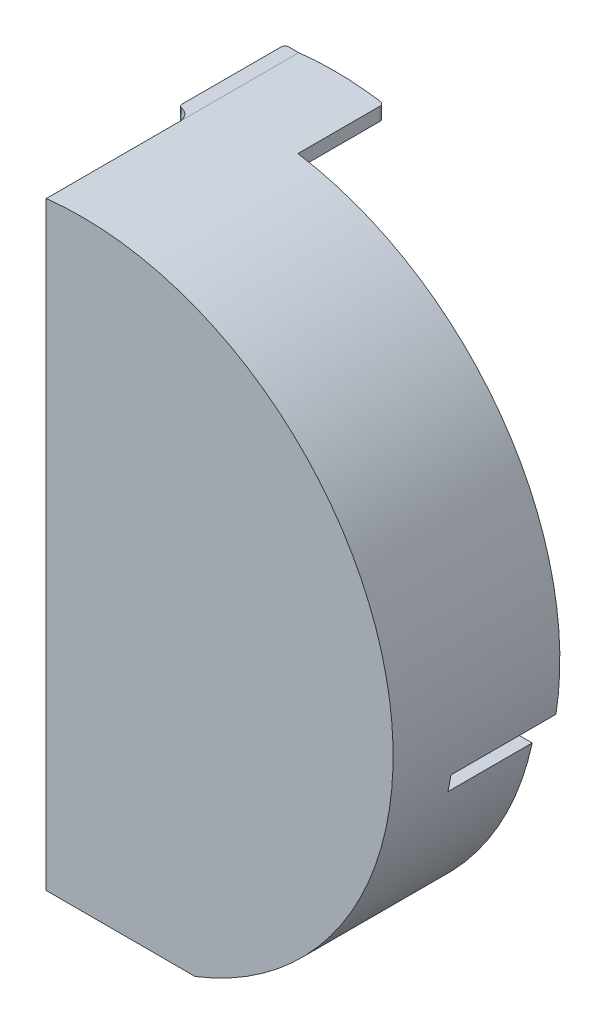
ISO-10303-21;
HEADER;
FILE_DESCRIPTION(('STEP AP214'),'2;1');
FILE_NAME('part.step','',(''),(''),'','','');
FILE_SCHEMA(('AUTOMOTIVE_DESIGN { 1 0 10303 214 1 1 1 1 }'));
ENDSEC;
DATA;
#1=APPLICATION_CONTEXT('core data for automotive mechanical design processes');
#2=APPLICATION_PROTOCOL_DEFINITION('international standard','automotive_design',2000,#1);
#3=PRODUCT_CONTEXT('',#1,'mechanical');
#4=PRODUCT('Part','Part','',(#3));
#5=PRODUCT_RELATED_PRODUCT_CATEGORY('part','',(#4));
#6=PRODUCT_DEFINITION_FORMATION('','',#4);
#7=PRODUCT_DEFINITION_CONTEXT('part definition',#1,'design');
#8=PRODUCT_DEFINITION('design','',#6,#7);
#9=PRODUCT_DEFINITION_SHAPE('','',#8);
#10=(LENGTH_UNIT() NAMED_UNIT(*) SI_UNIT(.MILLI.,.METRE.));
#11=(NAMED_UNIT(*) PLANE_ANGLE_UNIT() SI_UNIT($,.RADIAN.));
#12=(NAMED_UNIT(*) SI_UNIT($,.STERADIAN.) SOLID_ANGLE_UNIT());
#13=UNCERTAINTY_MEASURE_WITH_UNIT(LENGTH_MEASURE(1.E-05),#10,'distance_accuracy_value','');
#14=(GEOMETRIC_REPRESENTATION_CONTEXT(3) GLOBAL_UNCERTAINTY_ASSIGNED_CONTEXT((#13)) GLOBAL_UNIT_ASSIGNED_CONTEXT((#10,
#11,#12)) REPRESENTATION_CONTEXT('',''));
#15=CARTESIAN_POINT('',(0.,0.,0.));
#16=DIRECTION('',(0.,0.,1.));
#17=DIRECTION('',(1.,0.,0.));
#18=AXIS2_PLACEMENT_3D('',#15,#16,#17);
#19=CARTESIAN_POINT('',(38.1000196782588,0.,-197.056224621407));
#20=DIRECTION('',(1.,0.,0.));
#21=DIRECTION('',(0.,0.,-1.));
#22=AXIS2_PLACEMENT_3D('',#19,#20,#21);
#23=PLANE('',#22);
#24=DIRECTION('',(0.,0.,1.));
#25=VECTOR('',#24,1.);
#26=CARTESIAN_POINT('',(38.1000196782588,226.7922128743,-197.056224621407));
#27=LINE('',#26,#25);
#28=CARTESIAN_POINT('',(38.1000196782588,226.7922128743,-43.5200000000002));
#29=VERTEX_POINT('',#28);
#30=CARTESIAN_POINT('',(38.1000196782588,226.7922128743,-37.52));
#31=VERTEX_POINT('',#30);
#32=EDGE_CURVE('E255',#29,#31,#27,.T.);
#33=ORIENTED_EDGE('',*,*,#32,.F.);
#34=DIRECTION('',(0.,1.,0.));
#35=VECTOR('',#34,1.);
#36=CARTESIAN_POINT('',(38.1000196782588,236.956511833957,-43.5200000000002));
#37=LINE('',#36,#35);
#38=CARTESIAN_POINT('',(38.1000196782588,226.822372134047,-43.5200000000002));
#39=VERTEX_POINT('',#38);
#40=EDGE_CURVE('E205',#29,#39,#37,.T.);
#41=ORIENTED_EDGE('',*,*,#40,.T.);
#42=DIRECTION('',(0.,0.,1.));
#43=VECTOR('',#42,1.);
#44=CARTESIAN_POINT('',(38.1000196782588,226.822372134047,-384.810189539458));
#45=LINE('',#44,#43);
#46=CARTESIAN_POINT('',(38.1000196782588,226.822372134047,-37.52));
#47=VERTEX_POINT('',#46);
#48=EDGE_CURVE('E230',#39,#47,#45,.T.);
#49=ORIENTED_EDGE('',*,*,#48,.T.);
#50=DIRECTION('',(0.,1.,0.));
#51=VECTOR('',#50,1.);
#52=CARTESIAN_POINT('',(38.1000196782588,0.,-37.52));
#53=LINE('',#52,#51);
#54=EDGE_CURVE('E233',#31,#47,#53,.T.);
#55=ORIENTED_EDGE('',*,*,#54,.F.);
#56=EDGE_LOOP('',(#33,#41,#49,#55));
#57=FACE_BOUND('',#56,.T.);
#58=ADVANCED_FACE('F34',(#57),#23,.T.);
#59=CARTESIAN_POINT('',(0.,0.,-37.52));
#60=DIRECTION('',(0.,0.,-1.));
#61=DIRECTION('',(1.,0.,0.));
#62=AXIS2_PLACEMENT_3D('',#59,#60,#61);
#63=PLANE('',#62);
#64=CARTESIAN_POINT('',(0.,0.,-37.52));
#65=DIRECTION('',(0.,0.,-1.));
#66=DIRECTION('',(-1.,0.,0.));
#67=AXIS2_PLACEMENT_3D('',#64,#65,#66);
#68=CIRCLE('',#67,230.);
#69=CARTESIAN_POINT('',(224.453064385275,-50.2077871257001,-37.52));
#70=VERTEX_POINT('',#69);
#71=CARTESIAN_POINT('',(54.1856336417679,-223.526099386269,-37.52));
#72=VERTEX_POINT('',#71);
#73=EDGE_CURVE('E283',#70,#72,#68,.T.);
#74=ORIENTED_EDGE('',*,*,#73,.F.);
#75=DIRECTION('',(1.,0.,0.));
#76=VECTOR('',#75,1.);
#77=CARTESIAN_POINT('',(0.,-50.2077871257001,-37.52));
#78=LINE('',#77,#76);
#79=CARTESIAN_POINT('',(234.689535582523,-50.2077871257001,-37.52));
#80=VERTEX_POINT('',#79);
#81=EDGE_CURVE('E227',#70,#80,#78,.T.);
#82=ORIENTED_EDGE('',*,*,#81,.T.);
#83=CARTESIAN_POINT('',(0.,0.,-37.52));
#84=DIRECTION('',(0.,0.,-1.));
#85=DIRECTION('',(-1.,0.,0.));
#86=AXIS2_PLACEMENT_3D('',#83,#84,#85);
#87=CIRCLE('',#86,240.);
#88=CARTESIAN_POINT('',(87.3846834013827,-223.526099386269,-37.52));
#89=VERTEX_POINT('',#88);
#90=EDGE_CURVE('E284',#80,#89,#87,.T.);
#91=ORIENTED_EDGE('',*,*,#90,.T.);
#92=DIRECTION('',(-1.,0.,0.));
#93=VECTOR('',#92,1.);
#94=CARTESIAN_POINT('',(0.,-223.526099386269,-37.52));
#95=LINE('',#94,#93);
#96=EDGE_CURVE('E244',#89,#72,#95,.T.);
#97=ORIENTED_EDGE('',*,*,#96,.T.);
#98=EDGE_LOOP('',(#74,#82,#91,#97));
#99=FACE_BOUND('',#98,.T.);
#100=ADVANCED_FACE('F348',(#99),#63,.T.);
#101=CARTESIAN_POINT('',(0.,0.,75.));
#102=DIRECTION('',(0.,0.,-1.));
#103=DIRECTION('',(-1.,0.,0.));
#104=AXIS2_PLACEMENT_3D('',#101,#102,#103);
#105=CYLINDRICAL_SURFACE('',#104,240.);
#106=DIRECTION('',(0.,0.,1.));
#107=VECTOR('',#106,1.);
#108=CARTESIAN_POINT('',(38.1000196782588,236.956511833957,-197.056224621407));
#109=LINE('',#108,#107);
#110=CARTESIAN_POINT('',(38.1000196782588,236.956511833957,-116.72));
#111=VERTEX_POINT('',#110);
#112=CARTESIAN_POINT('',(38.1000196782588,236.956511833957,-53.5200000000002));
#113=VERTEX_POINT('',#112);
#114=EDGE_CURVE('E259',#111,#113,#109,.T.);
#115=ORIENTED_EDGE('',*,*,#114,.F.);
#116=CARTESIAN_POINT('',(38.1000196782588,236.956511833957,-116.72));
#117=CARTESIAN_POINT('',(38.1000283332697,236.95651011048,-116.803621264716));
#118=CARTESIAN_POINT('',(38.0965234851168,236.957073975032,-116.887238332852));
#119=CARTESIAN_POINT('',(38.0825536393504,236.959319715328,-117.05386781502));
#120=CARTESIAN_POINT('',(38.0720891647448,236.961001507062,-117.136880274014));
#121=CARTESIAN_POINT('',(38.0442825757925,236.965467423593,-117.301624172853));
#122=CARTESIAN_POINT('',(38.0269482227035,236.968250304427,-117.383356950473));
#123=CARTESIAN_POINT('',(37.985551774974,236.974889580629,-117.545031874675));
#124=CARTESIAN_POINT('',(37.9614897270087,236.978745968551,-117.624974033675));
#125=CARTESIAN_POINT('',(37.8794315428356,236.991881261317,-117.861324745224));
#126=CARTESIAN_POINT('',(37.8115480992835,237.002728759292,-118.014347353355));
#127=CARTESIAN_POINT('',(37.65154502077,237.028200165548,-118.306670709139));
#128=CARTESIAN_POINT('',(37.5594270297313,237.042823817678,-118.445972386655));
#129=CARTESIAN_POINT('',(37.353019352501,237.075437143725,-118.707950170494));
#130=CARTESIAN_POINT('',(37.2386040486746,237.093445866905,-118.830525058097));
#131=CARTESIAN_POINT('',(36.9912276153533,237.132167202571,-119.054784150787));
#132=CARTESIAN_POINT('',(36.8582623711494,237.152880414896,-119.156463708508));
#133=CARTESIAN_POINT('',(36.5758712262327,237.196598371745,-119.337310977152));
#134=CARTESIAN_POINT('',(36.4262671701791,237.219627601451,-119.41619432807));
#135=CARTESIAN_POINT('',(36.1161583087637,237.267038708309,-119.54768359203));
#136=CARTESIAN_POINT('',(35.9556583259373,237.291419986181,-119.600301045322));
#137=CARTESIAN_POINT('',(35.678657277023,237.333197369238,-119.665975831675));
#138=CARTESIAN_POINT('',(35.56378297137,237.350438918612,-119.686219970494));
#139=CARTESIAN_POINT('',(35.3326315107385,237.384959396251,-119.713231485017));
#140=CARTESIAN_POINT('',(35.2163565186467,237.402238239694,-119.720017483976));
#141=CARTESIAN_POINT('',(35.1000196782588,237.419436059026,-119.72));
#142=B_SPLINE_CURVE_WITH_KNOTS('',3,(#116,#117,#118,#119,#120,#121,#122,#123,#124,#125,#126,
#127,#128,#129,#130,#131,#132,#133,#134,#135,#136,#137,#138,#139,#140,#141),.UNSPECIFIED.,.F.,
.F.,(4,2,2,2,2,2,2,2,2,2,2,2,4),(0.,0.250781000405409,0.501543157033502,0.752022818571146,
1.00250074238649,1.50318660668064,2.00383851627479,2.5073970693745,3.0110674989086,
3.52077341414592,4.03025518618738,4.38325635885706,4.73576870987701),.UNSPECIFIED.);
#143=CARTESIAN_POINT('',(35.1000196782588,237.419436059026,-119.72));
#144=VERTEX_POINT('',#143);
#145=EDGE_CURVE('E327',#111,#144,#142,.T.);
#146=ORIENTED_EDGE('',*,*,#145,.T.);
#147=CARTESIAN_POINT('',(0.,0.,-119.72));
#148=DIRECTION('',(0.,0.,1.));
#149=DIRECTION('',(1.,0.,0.));
#150=AXIS2_PLACEMENT_3D('',#147,#148,#149);
#151=CIRCLE('',#150,240.);
#152=CARTESIAN_POINT('',(-27.4110339249947,238.429518346959,-119.72));
#153=VERTEX_POINT('',#152);
#154=EDGE_CURVE('E238',#144,#153,#151,.T.);
#155=ORIENTED_EDGE('',*,*,#154,.T.);
#156=DIRECTION('',(0.,0.,1.));
#157=VECTOR('',#156,1.);
#158=CARTESIAN_POINT('',(-27.4110339249947,238.429518346959,-197.056224621407));
#159=LINE('',#158,#157);
#160=CARTESIAN_POINT('',(-27.4110339249947,238.429518346959,-27.7270639354609));
#161=VERTEX_POINT('',#160);
#162=EDGE_CURVE('E239',#153,#161,#159,.T.);
#163=ORIENTED_EDGE('',*,*,#162,.T.);
#164=DIRECTION('',(0.,0.,-1.));
#165=VECTOR('',#164,1.);
#166=CARTESIAN_POINT('',(-27.4110339249947,238.429518346959,75.));
#167=LINE('',#166,#165);
#168=CARTESIAN_POINT('',(-27.4110339249947,238.429518346959,75.));
#169=VERTEX_POINT('',#168);
#170=EDGE_CURVE('E273',#169,#161,#167,.T.);
#171=ORIENTED_EDGE('',*,*,#170,.F.);
#172=CARTESIAN_POINT('',(0.,0.,75.));
#173=DIRECTION('',(0.,0.,1.));
#174=DIRECTION('',(1.,0.,0.));
#175=AXIS2_PLACEMENT_3D('',#172,#173,#174);
#176=CIRCLE('',#175,240.);
#177=CARTESIAN_POINT('',(87.3846834013827,-223.526099386269,75.));
#178=VERTEX_POINT('',#177);
#179=EDGE_CURVE('E286',#178,#169,#176,.T.);
#180=ORIENTED_EDGE('',*,*,#179,.F.);
#181=DIRECTION('',(0.,0.,-1.));
#182=VECTOR('',#181,1.);
#183=CARTESIAN_POINT('',(87.3846834013827,-223.526099386269,75.));
#184=LINE('',#183,#182);
#185=EDGE_CURVE('E266',#178,#89,#184,.T.);
#186=ORIENTED_EDGE('',*,*,#185,.T.);
#187=ORIENTED_EDGE('',*,*,#90,.F.);
#188=DIRECTION('',(0.,0.,-1.));
#189=VECTOR('',#188,1.);
#190=CARTESIAN_POINT('',(234.689535582523,-50.2077871257001,75.));
#191=LINE('',#190,#189);
#192=CARTESIAN_POINT('',(234.689535582523,-50.2077871257001,27.418));
#193=VERTEX_POINT('',#192);
#194=EDGE_CURVE('E299',#193,#80,#191,.T.);
#195=ORIENTED_EDGE('',*,*,#194,.F.);
#196=CARTESIAN_POINT('',(0.,0.,27.4179999999999));
#197=DIRECTION('',(0.,0.,-1.));
#198=DIRECTION('',(0.,1.,0.));
#199=AXIS2_PLACEMENT_3D('',#196,#197,#198);
#200=CIRCLE('',#199,240.);
#201=CARTESIAN_POINT('',(236.977735538125,-37.9677871257001,27.418));
#202=VERTEX_POINT('',#201);
#203=EDGE_CURVE('E184',#202,#193,#200,.T.);
#204=ORIENTED_EDGE('',*,*,#203,.F.);
#205=DIRECTION('',(0.,0.,-1.));
#206=VECTOR('',#205,1.);
#207=CARTESIAN_POINT('',(236.977735538125,-37.9677871257001,75.));
#208=LINE('',#207,#206);
#209=CARTESIAN_POINT('',(236.977735538125,-37.9677871257001,-53.52));
#210=VERTEX_POINT('',#209);
#211=EDGE_CURVE('E176',#202,#210,#208,.T.);
#212=ORIENTED_EDGE('',*,*,#211,.T.);
#213=CARTESIAN_POINT('',(0.,0.,-53.52));
#214=DIRECTION('',(0.,0.,-1.));
#215=DIRECTION('',(0.,1.,0.));
#216=AXIS2_PLACEMENT_3D('',#213,#214,#215);
#217=CIRCLE('',#216,240.);
#218=EDGE_CURVE('E181',#113,#210,#217,.T.);
#219=ORIENTED_EDGE('',*,*,#218,.F.);
#220=EDGE_LOOP('',(#115,#146,#155,#163,#171,#180,#186,#187,#195,#204,#212,#219));
#221=FACE_BOUND('',#220,.T.);
#222=ADVANCED_FACE('F179',(#221),#105,.T.);
#223=CARTESIAN_POINT('',(0.,0.,-716.342509939086));
#224=DIRECTION('',(0.,0.,1.));
#225=DIRECTION('',(1.,0.,0.));
#226=AXIS2_PLACEMENT_3D('',#223,#224,#225);
#227=CYLINDRICAL_SURFACE('',#226,230.);
#228=CARTESIAN_POINT('',(0.,0.,27.4179999999999));
#229=DIRECTION('',(0.,0.,-1.));
#230=DIRECTION('',(0.,1.,0.));
#231=AXIS2_PLACEMENT_3D('',#228,#229,#230);
#232=CIRCLE('',#231,230.);
#233=CARTESIAN_POINT('',(226.844543996054,-37.9677871257001,27.418));
#234=VERTEX_POINT('',#233);
#235=CARTESIAN_POINT('',(224.453064385275,-50.2077871257001,27.4179999999999));
#236=VERTEX_POINT('',#235);
#237=EDGE_CURVE('E297',#234,#236,#232,.T.);
#238=ORIENTED_EDGE('',*,*,#237,.T.);
#239=DIRECTION('',(0.,0.,1.));
#240=VECTOR('',#239,1.);
#241=CARTESIAN_POINT('',(224.453064385275,-50.2077871257001,-716.342509939086));
#242=LINE('',#241,#240);
#243=EDGE_CURVE('E219',#236,#70,#242,.F.);
#244=ORIENTED_EDGE('',*,*,#243,.T.);
#245=ORIENTED_EDGE('',*,*,#73,.T.);
#246=DIRECTION('',(0.,0.,1.));
#247=VECTOR('',#246,1.);
#248=CARTESIAN_POINT('',(54.1856336417679,-223.526099386269,-716.342509939086));
#249=LINE('',#248,#247);
#250=CARTESIAN_POINT('',(54.1856336417679,-223.526099386269,65.));
#251=VERTEX_POINT('',#250);
#252=EDGE_CURVE('E280',#72,#251,#249,.T.);
#253=ORIENTED_EDGE('',*,*,#252,.T.);
#254=CARTESIAN_POINT('',(0.,0.,65.));
#255=DIRECTION('',(0.,0.,-1.));
#256=DIRECTION('',(-1.,0.,0.));
#257=AXIS2_PLACEMENT_3D('',#254,#255,#256);
#258=CIRCLE('',#257,230.);
#259=CARTESIAN_POINT('',(-27.4110339249947,228.360756740651,65.));
#260=VERTEX_POINT('',#259);
#261=EDGE_CURVE('E287',#260,#251,#258,.T.);
#262=ORIENTED_EDGE('',*,*,#261,.F.);
#263=DIRECTION('',(0.,0.,1.));
#264=VECTOR('',#263,1.);
#265=CARTESIAN_POINT('',(-27.4110339249947,228.360756740651,-716.342509939086));
#266=LINE('',#265,#264);
#267=CARTESIAN_POINT('',(-27.4110339249947,228.360756740651,-27.727063935461));
#268=VERTEX_POINT('',#267);
#269=EDGE_CURVE('E272',#260,#268,#266,.F.);
#270=ORIENTED_EDGE('',*,*,#269,.T.);
#271=CARTESIAN_POINT('',(-27.4110339249947,228.360756740651,-27.7270639354609));
#272=CARTESIAN_POINT('',(-27.4110026944469,228.360756611881,-28.0066894563633));
#273=CARTESIAN_POINT('',(-27.4227611699095,228.359348952401,-28.2863101598484));
#274=CARTESIAN_POINT('',(-27.4696317401373,228.353717644928,-28.8435434665934));
#275=CARTESIAN_POINT('',(-27.5047424982714,228.349494158106,-29.1211561838665));
#276=CARTESIAN_POINT('',(-27.5980545360376,228.338234776237,-29.6721869355634));
#277=CARTESIAN_POINT('',(-27.656237314229,228.331201134616,-29.9456081491232));
#278=CARTESIAN_POINT('',(-27.7952515907846,228.314320444479,-30.4865385382274));
#279=CARTESIAN_POINT('',(-27.8760828503396,228.304473425626,-30.7540477760767));
#280=CARTESIAN_POINT('',(-28.0598386726819,228.281961637174,-31.2813776063041));
#281=CARTESIAN_POINT('',(-28.1627729721672,228.269295625679,-31.5411947526278));
#282=CARTESIAN_POINT('',(-28.3899536655858,228.241152348792,-32.0511867190916));
#283=CARTESIAN_POINT('',(-28.5142005667123,228.225675016496,-32.3013613095863));
#284=CARTESIAN_POINT('',(-28.7830477480775,228.191924705032,-32.790229934296));
#285=CARTESIAN_POINT('',(-28.9276420632085,228.173652545068,-33.0289273057878));
#286=CARTESIAN_POINT('',(-29.2361461685827,228.134328689678,-33.493250084445));
#287=CARTESIAN_POINT('',(-29.4000558641544,228.113277007877,-33.7188755556723));
#288=CARTESIAN_POINT('',(-29.7463693628216,228.068375826787,-34.1559700372033));
#289=CARTESIAN_POINT('',(-29.9288129500739,228.044520290865,-34.3674069046355));
#290=CARTESIAN_POINT('',(-30.3105577281843,227.994094543774,-34.7741218589904));
#291=CARTESIAN_POINT('',(-30.5098590311614,227.967524314548,-34.9693998384248));
#292=CARTESIAN_POINT('',(-30.9240031273137,227.911714717404,-35.3425861687152));
#293=CARTESIAN_POINT('',(-31.1388561260455,227.882473593395,-35.5204829301831));
#294=CARTESIAN_POINT('',(-31.582421791561,227.821422918785,-35.8575541031397));
#295=CARTESIAN_POINT('',(-31.8111340019585,227.789613452748,-36.0167291306311));
#296=CARTESIAN_POINT('',(-32.2825752515808,227.723280368335,-36.3164486651236));
#297=CARTESIAN_POINT('',(-32.5253980359553,227.688737869182,-36.4568415311182));
#298=CARTESIAN_POINT('',(-33.0216933784563,227.617289772794,-36.7166207550609));
#299=CARTESIAN_POINT('',(-33.2751657072976,227.580384226427,-36.8360075649833));
#300=CARTESIAN_POINT('',(-33.7904673633529,227.504443977609,-37.0528082532049));
#301=CARTESIAN_POINT('',(-34.0522808076119,227.465413231875,-37.1502613403722));
#302=CARTESIAN_POINT('',(-34.5827502717917,227.385367254227,-37.3228196054431));
#303=CARTESIAN_POINT('',(-34.8514021314605,227.344353215828,-37.3979380341388));
#304=CARTESIAN_POINT('',(-35.2072308226202,227.289371228092,-37.4815930931512));
#305=CARTESIAN_POINT('',(-35.2922021689188,227.276193007806,-37.5004015490016));
#306=CARTESIAN_POINT('',(-35.462493560728,227.249684178777,-37.5357712624951));
#307=CARTESIAN_POINT('',(-35.5478131529853,227.236353742327,-37.5523348314212));
#308=CARTESIAN_POINT('',(-35.6333306582748,227.222942825319,-37.5677839851064));
#309=B_SPLINE_CURVE_WITH_KNOTS('',3,(#271,#272,#273,#274,#275,#276,#277,#278,#279,#280,#281,
#282,#283,#284,#285,#286,#287,#288,#289,#290,#291,#292,#293,#294,#295,#296,#297,#298,#299,#300,
#301,#302,#303,#304,#305,#306,#307,#308),.UNSPECIFIED.,.F.,.F.,(4,2,2,2,2,2,2,2,2,2,2,2,2,2,2,2,
2,2,4),(0.,0.838619014669509,1.67719003284149,2.51508995680685,3.35298104614875,4.1912419982177,
5.02952290183138,5.86755856255371,6.70559011593558,7.54546017317989,8.38533581675492,
9.22576770168761,10.0661719260808,10.912997351349,11.7598045537682,12.605085757777,
13.4498644648113,13.7139046270904,13.9776708404597),.UNSPECIFIED.);
#310=CARTESIAN_POINT('',(-35.6333306582748,227.222942825319,-37.5677839851064));
#311=VERTEX_POINT('',#310);
#312=EDGE_CURVE('E12',#268,#311,#309,.T.);
#313=ORIENTED_EDGE('',*,*,#312,.T.);
#314=CARTESIAN_POINT('',(-35.1000196782588,227.305936171024,-37.52));
#315=CARTESIAN_POINT('',(-35.1896163751834,227.292100033902,-37.5200158656468));
#316=CARTESIAN_POINT('',(-35.2788573053136,227.278265853199,-37.5240057972291));
#317=CARTESIAN_POINT('',(-35.4566276319856,227.25060140463,-37.5399337922645));
#318=CARTESIAN_POINT('',(-35.5451570285274,227.236771136765,-37.5518718557177));
#319=CARTESIAN_POINT('',(-35.6333306582748,227.222942825319,-37.5677839851064));
#320=B_SPLINE_CURVE_WITH_KNOTS('',3,(#314,#315,#316,#317,#318,#319),.UNSPECIFIED.,.F.,.F.,(4,2,
4),(0.,0.271184862192747,0.542369724385522),.UNSPECIFIED.);
#321=CARTESIAN_POINT('',(-35.1000196782588,227.305936171024,-37.52));
#322=VERTEX_POINT('',#321);
#323=EDGE_CURVE('E335',#322,#311,#320,.T.);
#324=ORIENTED_EDGE('',*,*,#323,.F.);
#325=EDGE_CURVE('E55',#322,#47,#68,.T.);
#326=ORIENTED_EDGE('',*,*,#325,.T.);
#327=ORIENTED_EDGE('',*,*,#48,.F.);
#328=CARTESIAN_POINT('',(0.,0.,-43.52));
#329=DIRECTION('',(0.,0.,-1.));
#330=DIRECTION('',(0.,1.,0.));
#331=AXIS2_PLACEMENT_3D('',#328,#329,#330);
#332=CIRCLE('',#331,230.);
#333=CARTESIAN_POINT('',(226.844543996054,-37.9677871257001,-43.52));
#334=VERTEX_POINT('',#333);
#335=EDGE_CURVE('E231',#334,#39,#332,.F.);
#336=ORIENTED_EDGE('',*,*,#335,.F.);
#337=DIRECTION('',(0.,0.,1.));
#338=VECTOR('',#337,1.);
#339=CARTESIAN_POINT('',(226.844543996054,-37.9677871257003,-716.342509939086));
#340=LINE('',#339,#338);
#341=EDGE_CURVE('E188',#234,#334,#340,.F.);
#342=ORIENTED_EDGE('',*,*,#341,.F.);
#343=EDGE_LOOP('',(#238,#244,#245,#253,#262,#270,#313,#324,#326,#327,#336,#342));
#344=FACE_BOUND('',#343,.T.);
#345=ADVANCED_FACE('F347',(#344),#227,.F.);
#346=DIRECTION('',(0.,1.,0.));
#347=VECTOR('',#346,1.);
#348=CARTESIAN_POINT('',(38.1000196782588,236.956511833957,-53.5200000000002));
#349=LINE('',#348,#347);
#350=CARTESIAN_POINT('',(38.1000196782588,226.7922128743,-53.5200000000002));
#351=VERTEX_POINT('',#350);
#352=EDGE_CURVE('E198',#351,#113,#349,.T.);
#353=ORIENTED_EDGE('',*,*,#352,.F.);
#354=CARTESIAN_POINT('',(38.1000196782588,226.7922128743,-116.72));
#355=VERTEX_POINT('',#354);
#356=EDGE_CURVE('E256',#355,#351,#27,.T.);
#357=ORIENTED_EDGE('',*,*,#356,.F.);
#358=DIRECTION('',(0.,-1.,0.));
#359=VECTOR('',#358,1.);
#360=CARTESIAN_POINT('',(38.1000196782588,236.956511833957,-116.72));
#361=LINE('',#360,#359);
#362=EDGE_CURVE('E325',#355,#111,#361,.F.);
#363=ORIENTED_EDGE('',*,*,#362,.T.);
#364=ORIENTED_EDGE('',*,*,#114,.T.);
#365=EDGE_LOOP('',(#353,#357,#363,#364));
#366=FACE_BOUND('',#365,.T.);
#367=ADVANCED_FACE('F368',(#366),#23,.T.);
#368=CARTESIAN_POINT('',(0.,0.,75.));
#369=DIRECTION('',(0.,0.,1.));
#370=DIRECTION('',(1.,0.,0.));
#371=AXIS2_PLACEMENT_3D('',#368,#369,#370);
#372=PLANE('',#371);
#373=DIRECTION('',(0.,1.,0.));
#374=VECTOR('',#373,1.);
#375=CARTESIAN_POINT('',(-27.4110339249947,0.,75.));
#376=LINE('',#375,#374);
#377=CARTESIAN_POINT('',(-27.4110339249947,-223.526099386269,75.));
#378=VERTEX_POINT('',#377);
#379=EDGE_CURVE('E264',#378,#169,#376,.T.);
#380=ORIENTED_EDGE('',*,*,#379,.F.);
#381=DIRECTION('',(-1.,0.,0.));
#382=VECTOR('',#381,1.);
#383=CARTESIAN_POINT('',(0.,-223.526099386269,75.));
#384=LINE('',#383,#382);
#385=EDGE_CURVE('E262',#178,#378,#384,.T.);
#386=ORIENTED_EDGE('',*,*,#385,.F.);
#387=ORIENTED_EDGE('',*,*,#179,.T.);
#388=EDGE_LOOP('',(#380,#386,#387));
#389=FACE_BOUND('',#388,.T.);
#390=ADVANCED_FACE('F378',(#389),#372,.T.);
#391=CARTESIAN_POINT('',(0.,0.,65.));
#392=DIRECTION('',(0.,0.,1.));
#393=DIRECTION('',(1.,0.,0.));
#394=AXIS2_PLACEMENT_3D('',#391,#392,#393);
#395=PLANE('',#394);
#396=DIRECTION('',(1.,0.,0.));
#397=VECTOR('',#396,1.);
#398=CARTESIAN_POINT('',(0.,-223.526099386269,65.));
#399=LINE('',#398,#397);
#400=CARTESIAN_POINT('',(-27.4110339249947,-223.526099386269,65.));
#401=VERTEX_POINT('',#400);
#402=EDGE_CURVE('E295',#401,#251,#399,.T.);
#403=ORIENTED_EDGE('',*,*,#402,.F.);
#404=DIRECTION('',(0.,-1.,0.));
#405=VECTOR('',#404,1.);
#406=CARTESIAN_POINT('',(-27.4110339249947,0.,65.));
#407=LINE('',#406,#405);
#408=EDGE_CURVE('E293',#260,#401,#407,.T.);
#409=ORIENTED_EDGE('',*,*,#408,.F.);
#410=ORIENTED_EDGE('',*,*,#261,.T.);
#411=EDGE_LOOP('',(#403,#409,#410));
#412=FACE_BOUND('',#411,.T.);
#413=ADVANCED_FACE('F349',(#412),#395,.F.);
#414=CARTESIAN_POINT('',(0.,-223.526099386269,75.));
#415=DIRECTION('',(0.,-1.,0.));
#416=DIRECTION('',(0.,0.,-1.));
#417=AXIS2_PLACEMENT_3D('',#414,#415,#416);
#418=PLANE('',#417);
#419=ORIENTED_EDGE('',*,*,#96,.F.);
#420=ORIENTED_EDGE('',*,*,#185,.F.);
#421=ORIENTED_EDGE('',*,*,#385,.T.);
#422=DIRECTION('',(0.,0.,-1.));
#423=VECTOR('',#422,1.);
#424=CARTESIAN_POINT('',(-27.4110339249947,-223.526099386269,75.));
#425=LINE('',#424,#423);
#426=EDGE_CURVE('E269',#378,#401,#425,.T.);
#427=ORIENTED_EDGE('',*,*,#426,.T.);
#428=ORIENTED_EDGE('',*,*,#402,.T.);
#429=ORIENTED_EDGE('',*,*,#252,.F.);
#430=EDGE_LOOP('',(#419,#420,#421,#427,#428,#429));
#431=FACE_BOUND('',#430,.T.);
#432=ADVANCED_FACE('F427',(#431),#418,.T.);
#433=CARTESIAN_POINT('',(-27.4110339249947,0.,75.));
#434=DIRECTION('',(-1.,0.,0.));
#435=DIRECTION('',(0.,0.,1.));
#436=AXIS2_PLACEMENT_3D('',#433,#434,#435);
#437=PLANE('',#436);
#438=ORIENTED_EDGE('',*,*,#170,.T.);
#439=DIRECTION('',(0.,-1.,0.));
#440=VECTOR('',#439,1.);
#441=CARTESIAN_POINT('',(-27.4110339249947,228.360756740651,-27.7270639354609));
#442=LINE('',#441,#440);
#443=EDGE_CURVE('E407',#161,#268,#442,.T.);
#444=ORIENTED_EDGE('',*,*,#443,.T.);
#445=ORIENTED_EDGE('',*,*,#269,.F.);
#446=ORIENTED_EDGE('',*,*,#408,.T.);
#447=ORIENTED_EDGE('',*,*,#426,.F.);
#448=ORIENTED_EDGE('',*,*,#379,.T.);
#449=EDGE_LOOP('',(#438,#444,#445,#446,#447,#448));
#450=FACE_BOUND('',#449,.T.);
#451=ADVANCED_FACE('F405',(#450),#437,.T.);
#452=CARTESIAN_POINT('',(0.,0.,-37.52));
#453=DIRECTION('',(0.,0.,-1.));
#454=DIRECTION('',(-1.,0.,0.));
#455=AXIS2_PLACEMENT_3D('',#452,#453,#454);
#456=PLANE('',#455);
#457=ORIENTED_EDGE('',*,*,#325,.F.);
#458=DIRECTION('',(0.,1.,0.));
#459=VECTOR('',#458,1.);
#460=CARTESIAN_POINT('',(-35.1000196782588,0.,-37.52));
#461=LINE('',#460,#459);
#462=CARTESIAN_POINT('',(-35.1000196782588,226.7922128743,-37.52));
#463=VERTEX_POINT('',#462);
#464=EDGE_CURVE('E312',#322,#463,#461,.F.);
#465=ORIENTED_EDGE('',*,*,#464,.T.);
#466=DIRECTION('',(1.,0.,0.));
#467=VECTOR('',#466,1.);
#468=CARTESIAN_POINT('',(0.,226.7922128743,-37.52));
#469=LINE('',#468,#467);
#470=EDGE_CURVE('E246',#463,#31,#469,.T.);
#471=ORIENTED_EDGE('',*,*,#470,.T.);
#472=ORIENTED_EDGE('',*,*,#54,.T.);
#473=EDGE_LOOP('',(#457,#465,#471,#472));
#474=FACE_BOUND('',#473,.T.);
#475=ADVANCED_FACE('F442',(#474),#456,.F.);
#476=CARTESIAN_POINT('',(-38.1000196782588,0.,-197.056224621407));
#477=DIRECTION('',(1.,0.,0.));
#478=DIRECTION('',(0.,0.,-1.));
#479=AXIS2_PLACEMENT_3D('',#476,#477,#478);
#480=PLANE('',#479);
#481=DIRECTION('',(0.,0.,1.));
#482=VECTOR('',#481,1.);
#483=CARTESIAN_POINT('',(-38.1000196782588,226.7922128743,-197.056224621407));
#484=LINE('',#483,#482);
#485=CARTESIAN_POINT('',(-38.1000196782588,226.7922128743,-116.72));
#486=VERTEX_POINT('',#485);
#487=CARTESIAN_POINT('',(-38.1000196782589,226.7922128743,-40.52));
#488=VERTEX_POINT('',#487);
#489=EDGE_CURVE('E252',#486,#488,#484,.T.);
#490=ORIENTED_EDGE('',*,*,#489,.T.);
#491=DIRECTION('',(0.,1.,0.));
#492=VECTOR('',#491,1.);
#493=CARTESIAN_POINT('',(-38.1000196782589,0.,-40.52));
#494=LINE('',#493,#492);
#495=CARTESIAN_POINT('',(-38.1000196782589,238.429518346959,-40.52));
#496=VERTEX_POINT('',#495);
#497=EDGE_CURVE('E304',#488,#496,#494,.T.);
#498=ORIENTED_EDGE('',*,*,#497,.T.);
#499=DIRECTION('',(0.,0.,1.));
#500=VECTOR('',#499,1.);
#501=CARTESIAN_POINT('',(-38.1000196782588,238.429518346959,-197.056224621407));
#502=LINE('',#501,#500);
#503=CARTESIAN_POINT('',(-38.1000196782588,238.429518346959,-116.72));
#504=VERTEX_POINT('',#503);
#505=EDGE_CURVE('E249',#504,#496,#502,.T.);
#506=ORIENTED_EDGE('',*,*,#505,.F.);
#507=DIRECTION('',(0.,-1.,0.));
#508=VECTOR('',#507,1.);
#509=CARTESIAN_POINT('',(-38.1000196782588,0.,-116.72));
#510=LINE('',#509,#508);
#511=EDGE_CURVE('E301',#504,#486,#510,.T.);
#512=ORIENTED_EDGE('',*,*,#511,.T.);
#513=EDGE_LOOP('',(#490,#498,#506,#512));
#514=FACE_BOUND('',#513,.T.);
#515=ADVANCED_FACE('F444',(#514),#480,.F.);
#516=CARTESIAN_POINT('',(0.,226.7922128743,-197.056224621407));
#517=DIRECTION('',(0.,-1.,0.));
#518=DIRECTION('',(0.,0.,-1.));
#519=AXIS2_PLACEMENT_3D('',#516,#517,#518);
#520=PLANE('',#519);
#521=ORIENTED_EDGE('',*,*,#470,.F.);
#522=CARTESIAN_POINT('',(-35.1000196782588,226.7922128743,-40.52));
#523=DIRECTION('',(0.,-1.,0.));
#524=DIRECTION('',(0.,0.,-1.));
#525=AXIS2_PLACEMENT_3D('',#522,#523,#524);
#526=CIRCLE('',#525,3.);
#527=EDGE_CURVE('E318',#463,#488,#526,.T.);
#528=ORIENTED_EDGE('',*,*,#527,.T.);
#529=ORIENTED_EDGE('',*,*,#489,.F.);
#530=CARTESIAN_POINT('',(-35.1000196782588,226.7922128743,-116.72));
#531=DIRECTION('',(0.,-1.,0.));
#532=DIRECTION('',(0.,0.,-1.));
#533=AXIS2_PLACEMENT_3D('',#530,#531,#532);
#534=CIRCLE('',#533,3.);
#535=CARTESIAN_POINT('',(-35.1000196782588,226.7922128743,-119.72));
#536=VERTEX_POINT('',#535);
#537=EDGE_CURVE('E314',#486,#536,#534,.T.);
#538=ORIENTED_EDGE('',*,*,#537,.T.);
#539=DIRECTION('',(-1.,0.,0.));
#540=VECTOR('',#539,1.);
#541=CARTESIAN_POINT('',(0.,226.7922128743,-119.72));
#542=LINE('',#541,#540);
#543=CARTESIAN_POINT('',(35.1000196782588,226.7922128743,-119.72));
#544=VERTEX_POINT('',#543);
#545=EDGE_CURVE('E235',#544,#536,#542,.T.);
#546=ORIENTED_EDGE('',*,*,#545,.F.);
#547=CARTESIAN_POINT('',(35.1000196782588,226.7922128743,-116.72));
#548=DIRECTION('',(0.,-1.,0.));
#549=DIRECTION('',(0.,0.,-1.));
#550=AXIS2_PLACEMENT_3D('',#547,#548,#549);
#551=CIRCLE('',#550,3.);
#552=EDGE_CURVE('E316',#544,#355,#551,.T.);
#553=ORIENTED_EDGE('',*,*,#552,.T.);
#554=ORIENTED_EDGE('',*,*,#356,.T.);
#555=DIRECTION('',(0.,0.,1.));
#556=VECTOR('',#555,1.);
#557=CARTESIAN_POINT('',(38.1000196782588,226.7922128743,-197.056224621407));
#558=LINE('',#557,#556);
#559=EDGE_CURVE('E213',#351,#29,#558,.T.);
#560=ORIENTED_EDGE('',*,*,#559,.T.);
#561=ORIENTED_EDGE('',*,*,#32,.T.);
#562=EDGE_LOOP('',(#521,#528,#529,#538,#546,#553,#554,#560,#561));
#563=FACE_BOUND('',#562,.T.);
#564=ADVANCED_FACE('F390',(#563),#520,.T.);
#565=CARTESIAN_POINT('',(0.,238.429518346959,-197.056224621407));
#566=DIRECTION('',(0.,-1.,0.));
#567=DIRECTION('',(0.,0.,-1.));
#568=AXIS2_PLACEMENT_3D('',#565,#566,#567);
#569=PLANE('',#568);
#570=ORIENTED_EDGE('',*,*,#505,.T.);
#571=CARTESIAN_POINT('',(-35.1000196782588,238.429518346959,-40.52));
#572=DIRECTION('',(0.,-1.,0.));
#573=DIRECTION('',(0.,0.,-1.));
#574=AXIS2_PLACEMENT_3D('',#571,#572,#573);
#575=CIRCLE('',#574,3.);
#576=CARTESIAN_POINT('',(-35.6333306582748,238.429518346959,-37.5677839851064));
#577=VERTEX_POINT('',#576);
#578=EDGE_CURVE('E309',#496,#577,#575,.F.);
#579=ORIENTED_EDGE('',*,*,#578,.T.);
#580=CARTESIAN_POINT('',(-37.4110339249947,238.429518346959,-27.7270639354609));
#581=DIRECTION('',(0.,-1.,0.));
#582=DIRECTION('',(0.,0.,-1.));
#583=AXIS2_PLACEMENT_3D('',#580,#581,#582);
#584=CIRCLE('',#583,10.);
#585=EDGE_CURVE('E49',#577,#161,#584,.T.);
#586=ORIENTED_EDGE('',*,*,#585,.T.);
#587=ORIENTED_EDGE('',*,*,#162,.F.);
#588=DIRECTION('',(-1.,0.,0.));
#589=VECTOR('',#588,1.);
#590=CARTESIAN_POINT('',(0.,238.429518346959,-119.72));
#591=LINE('',#590,#589);
#592=CARTESIAN_POINT('',(-35.1000196782588,238.429518346959,-119.72));
#593=VERTEX_POINT('',#592);
#594=EDGE_CURVE('E241',#153,#593,#591,.T.);
#595=ORIENTED_EDGE('',*,*,#594,.T.);
#596=CARTESIAN_POINT('',(-35.1000196782588,238.429518346959,-116.72));
#597=DIRECTION('',(0.,-1.,0.));
#598=DIRECTION('',(0.,0.,-1.));
#599=AXIS2_PLACEMENT_3D('',#596,#597,#598);
#600=CIRCLE('',#599,3.);
#601=EDGE_CURVE('E307',#593,#504,#600,.F.);
#602=ORIENTED_EDGE('',*,*,#601,.T.);
#603=EDGE_LOOP('',(#570,#579,#586,#587,#595,#602));
#604=FACE_BOUND('',#603,.T.);
#605=ADVANCED_FACE('F410',(#604),#569,.F.);
#606=CARTESIAN_POINT('',(0.,-38.2077871257001,-119.72));
#607=DIRECTION('',(0.,0.,1.));
#608=DIRECTION('',(0.,1.,0.));
#609=AXIS2_PLACEMENT_3D('',#606,#607,#608);
#610=PLANE('',#609);
#611=ORIENTED_EDGE('',*,*,#154,.F.);
#612=DIRECTION('',(0.,-1.,0.));
#613=VECTOR('',#612,1.);
#614=CARTESIAN_POINT('',(35.1000196782588,226.7922128743,-119.72));
#615=LINE('',#614,#613);
#616=EDGE_CURVE('E322',#144,#544,#615,.T.);
#617=ORIENTED_EDGE('',*,*,#616,.T.);
#618=ORIENTED_EDGE('',*,*,#545,.T.);
#619=DIRECTION('',(0.,-1.,0.));
#620=VECTOR('',#619,1.);
#621=CARTESIAN_POINT('',(-35.1000196782588,-38.2077871257001,-119.72));
#622=LINE('',#621,#620);
#623=EDGE_CURVE('E320',#536,#593,#622,.F.);
#624=ORIENTED_EDGE('',*,*,#623,.T.);
#625=ORIENTED_EDGE('',*,*,#594,.F.);
#626=EDGE_LOOP('',(#611,#617,#618,#624,#625));
#627=FACE_BOUND('',#626,.T.);
#628=ADVANCED_FACE('F396',(#627),#610,.F.);
#629=CARTESIAN_POINT('',(96.9,-122.03500429421,27.418));
#630=DIRECTION('',(0.,0.,-1.));
#631=DIRECTION('',(-1.,0.,0.));
#632=AXIS2_PLACEMENT_3D('',#629,#630,#631);
#633=PLANE('',#632);
#634=ORIENTED_EDGE('',*,*,#203,.T.);
#635=DIRECTION('',(-1.,0.,0.));
#636=VECTOR('',#635,1.);
#637=CARTESIAN_POINT('',(240.,-50.2077871257001,27.418));
#638=LINE('',#637,#636);
#639=EDGE_CURVE('E216',#193,#236,#638,.T.);
#640=ORIENTED_EDGE('',*,*,#639,.T.);
#641=ORIENTED_EDGE('',*,*,#237,.F.);
#642=DIRECTION('',(-1.,0.,0.));
#643=VECTOR('',#642,1.);
#644=CARTESIAN_POINT('',(96.9,-37.9677871257001,27.418));
#645=LINE('',#644,#643);
#646=EDGE_CURVE('E222',#202,#234,#645,.T.);
#647=ORIENTED_EDGE('',*,*,#646,.F.);
#648=EDGE_LOOP('',(#634,#640,#641,#647));
#649=FACE_BOUND('',#648,.T.);
#650=ADVANCED_FACE('F434',(#649),#633,.T.);
#651=CARTESIAN_POINT('',(96.9,-37.9677871257001,-81.62));
#652=DIRECTION('',(0.,1.,0.));
#653=DIRECTION('',(1.,0.,0.));
#654=AXIS2_PLACEMENT_3D('',#651,#652,#653);
#655=PLANE('',#654);
#656=ORIENTED_EDGE('',*,*,#646,.T.);
#657=ORIENTED_EDGE('',*,*,#341,.T.);
#658=DIRECTION('',(-1.,0.,0.));
#659=VECTOR('',#658,1.);
#660=CARTESIAN_POINT('',(38.1000196782588,-37.9677871257001,-43.52));
#661=LINE('',#660,#659);
#662=CARTESIAN_POINT('',(38.1000196782588,-37.9677871257001,-43.52));
#663=VERTEX_POINT('',#662);
#664=EDGE_CURVE('E210',#334,#663,#661,.T.);
#665=ORIENTED_EDGE('',*,*,#664,.T.);
#666=DIRECTION('',(0.,0.,1.));
#667=VECTOR('',#666,1.);
#668=CARTESIAN_POINT('',(38.1000196782588,-37.9677871257001,-53.52));
#669=LINE('',#668,#667);
#670=CARTESIAN_POINT('',(38.1000196782588,-37.9677871257001,-53.52));
#671=VERTEX_POINT('',#670);
#672=EDGE_CURVE('E194',#671,#663,#669,.T.);
#673=ORIENTED_EDGE('',*,*,#672,.F.);
#674=DIRECTION('',(-1.,0.,0.));
#675=VECTOR('',#674,1.);
#676=CARTESIAN_POINT('',(226.844543996054,-37.9677871257001,-53.52));
#677=LINE('',#676,#675);
#678=EDGE_CURVE('E191',#210,#671,#677,.T.);
#679=ORIENTED_EDGE('',*,*,#678,.F.);
#680=ORIENTED_EDGE('',*,*,#211,.F.);
#681=EDGE_LOOP('',(#656,#657,#665,#673,#679,#680));
#682=FACE_BOUND('',#681,.T.);
#683=ADVANCED_FACE('F192',(#682),#655,.F.);
#684=CARTESIAN_POINT('',(96.9,-50.2077871257001,-81.62));
#685=DIRECTION('',(0.,1.,0.));
#686=DIRECTION('',(1.,0.,0.));
#687=AXIS2_PLACEMENT_3D('',#684,#685,#686);
#688=PLANE('',#687);
#689=ORIENTED_EDGE('',*,*,#81,.F.);
#690=ORIENTED_EDGE('',*,*,#243,.F.);
#691=ORIENTED_EDGE('',*,*,#639,.F.);
#692=ORIENTED_EDGE('',*,*,#194,.T.);
#693=EDGE_LOOP('',(#689,#690,#691,#692));
#694=FACE_BOUND('',#693,.T.);
#695=ADVANCED_FACE('F354',(#694),#688,.T.);
#696=CARTESIAN_POINT('',(-35.1000196782588,0.,-40.52));
#697=DIRECTION('',(0.,1.,0.));
#698=DIRECTION('',(0.,0.,1.));
#699=AXIS2_PLACEMENT_3D('',#696,#697,#698);
#700=CYLINDRICAL_SURFACE('',#699,3.);
#701=ORIENTED_EDGE('',*,*,#323,.T.);
#702=DIRECTION('',(0.,1.,0.));
#703=VECTOR('',#702,1.);
#704=CARTESIAN_POINT('',(-35.6333306582748,0.,-37.5677839851064));
#705=LINE('',#704,#703);
#706=EDGE_CURVE('E415',#311,#577,#705,.T.);
#707=ORIENTED_EDGE('',*,*,#706,.T.);
#708=ORIENTED_EDGE('',*,*,#578,.F.);
#709=ORIENTED_EDGE('',*,*,#497,.F.);
#710=ORIENTED_EDGE('',*,*,#527,.F.);
#711=ORIENTED_EDGE('',*,*,#464,.F.);
#712=EDGE_LOOP('',(#701,#707,#708,#709,#710,#711));
#713=FACE_BOUND('',#712,.T.);
#714=ADVANCED_FACE('F351',(#713),#700,.T.);
#715=CARTESIAN_POINT('',(35.1000196782588,-38.2077871257001,-116.72));
#716=DIRECTION('',(0.,1.,0.));
#717=DIRECTION('',(0.,0.,1.));
#718=AXIS2_PLACEMENT_3D('',#715,#716,#717);
#719=CYLINDRICAL_SURFACE('',#718,3.);
#720=ORIENTED_EDGE('',*,*,#145,.F.);
#721=ORIENTED_EDGE('',*,*,#362,.F.);
#722=ORIENTED_EDGE('',*,*,#552,.F.);
#723=ORIENTED_EDGE('',*,*,#616,.F.);
#724=EDGE_LOOP('',(#720,#721,#722,#723));
#725=FACE_BOUND('',#724,.T.);
#726=ADVANCED_FACE('F342',(#725),#719,.T.);
#727=CARTESIAN_POINT('',(-35.1000196782588,0.,-116.72));
#728=DIRECTION('',(0.,-1.,0.));
#729=DIRECTION('',(0.,0.,-1.));
#730=AXIS2_PLACEMENT_3D('',#727,#728,#729);
#731=CYLINDRICAL_SURFACE('',#730,3.);
#732=ORIENTED_EDGE('',*,*,#601,.F.);
#733=ORIENTED_EDGE('',*,*,#623,.F.);
#734=ORIENTED_EDGE('',*,*,#537,.F.);
#735=ORIENTED_EDGE('',*,*,#511,.F.);
#736=EDGE_LOOP('',(#732,#733,#734,#735));
#737=FACE_BOUND('',#736,.T.);
#738=ADVANCED_FACE('F360',(#737),#731,.T.);
#739=CARTESIAN_POINT('',(-37.4110339249947,0.,-27.7270639354609));
#740=DIRECTION('',(0.,1.,0.));
#741=DIRECTION('',(0.,0.,1.));
#742=AXIS2_PLACEMENT_3D('',#739,#740,#741);
#743=CYLINDRICAL_SURFACE('',#742,10.);
#744=ORIENTED_EDGE('',*,*,#312,.F.);
#745=ORIENTED_EDGE('',*,*,#443,.F.);
#746=ORIENTED_EDGE('',*,*,#585,.F.);
#747=ORIENTED_EDGE('',*,*,#706,.F.);
#748=EDGE_LOOP('',(#744,#745,#746,#747));
#749=FACE_BOUND('',#748,.T.);
#750=ADVANCED_FACE('F36',(#749),#743,.F.);
#751=CARTESIAN_POINT('',(38.1000196782588,236.956511833957,-53.5200000000002));
#752=DIRECTION('',(1.,0.,0.));
#753=DIRECTION('',(0.,0.,-1.));
#754=AXIS2_PLACEMENT_3D('',#751,#752,#753);
#755=PLANE('',#754);
#756=ORIENTED_EDGE('',*,*,#559,.F.);
#757=EDGE_CURVE('E208',#671,#351,#349,.T.);
#758=ORIENTED_EDGE('',*,*,#757,.F.);
#759=ORIENTED_EDGE('',*,*,#672,.T.);
#760=EDGE_CURVE('E202',#663,#29,#37,.T.);
#761=ORIENTED_EDGE('',*,*,#760,.T.);
#762=EDGE_LOOP('',(#756,#758,#759,#761));
#763=FACE_BOUND('',#762,.T.);
#764=ADVANCED_FACE('F619',(#763),#755,.F.);
#765=CARTESIAN_POINT('',(0.,0.,-53.52));
#766=DIRECTION('',(0.,0.,-1.));
#767=DIRECTION('',(0.,1.,0.));
#768=AXIS2_PLACEMENT_3D('',#765,#766,#767);
#769=PLANE('',#768);
#770=ORIENTED_EDGE('',*,*,#218,.T.);
#771=ORIENTED_EDGE('',*,*,#678,.T.);
#772=ORIENTED_EDGE('',*,*,#757,.T.);
#773=ORIENTED_EDGE('',*,*,#352,.T.);
#774=EDGE_LOOP('',(#770,#771,#772,#773));
#775=FACE_BOUND('',#774,.T.);
#776=ADVANCED_FACE('F200',(#775),#769,.T.);
#777=CARTESIAN_POINT('',(0.,0.,-43.52));
#778=DIRECTION('',(0.,0.,-1.));
#779=DIRECTION('',(0.,1.,0.));
#780=AXIS2_PLACEMENT_3D('',#777,#778,#779);
#781=PLANE('',#780);
#782=ORIENTED_EDGE('',*,*,#335,.T.);
#783=ORIENTED_EDGE('',*,*,#40,.F.);
#784=ORIENTED_EDGE('',*,*,#760,.F.);
#785=ORIENTED_EDGE('',*,*,#664,.F.);
#786=EDGE_LOOP('',(#782,#783,#784,#785));
#787=FACE_BOUND('',#786,.T.);
#788=ADVANCED_FACE('F439',(#787),#781,.F.);
#789=CLOSED_SHELL('',(#58,#100,#222,#345,#367,#390,#413,#432,#451,#475,#515,#564,#605,#628,#650,
#683,#695,#714,#726,#738,#750,#764,#776,#788));
#790=MANIFOLD_SOLID_BREP('B2',#789);
#791=ADVANCED_BREP_SHAPE_REPRESENTATION('',(#18,#790),#14);
#792=SHAPE_DEFINITION_REPRESENTATION(#9,#791);
ENDSEC;
END-ISO-10303-21;
